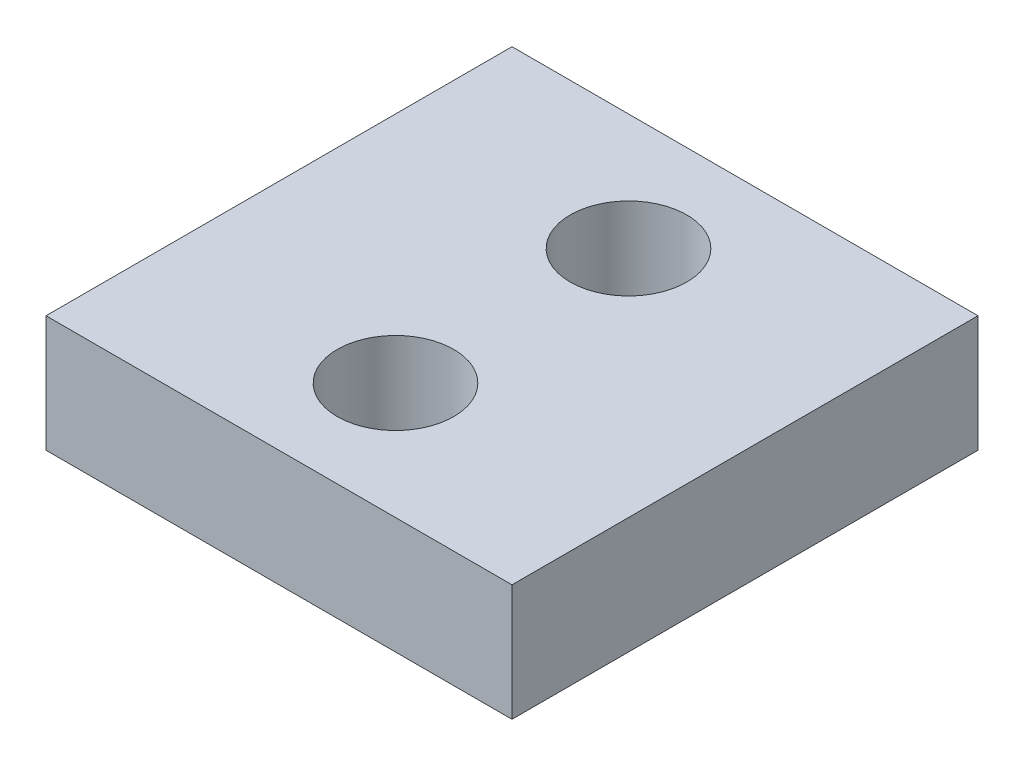
ISO-10303-21;
HEADER;
FILE_DESCRIPTION(('STEP AP214'),'2;1');
FILE_NAME('part.step','',(''),(''),'','','');
FILE_SCHEMA(('AUTOMOTIVE_DESIGN { 1 0 10303 214 1 1 1 1 }'));
ENDSEC;
DATA;
#1=APPLICATION_CONTEXT('core data for automotive mechanical design processes');
#2=APPLICATION_PROTOCOL_DEFINITION('international standard','automotive_design',2000,#1);
#3=PRODUCT_CONTEXT('',#1,'mechanical');
#4=PRODUCT('Part','Part','',(#3));
#5=PRODUCT_RELATED_PRODUCT_CATEGORY('part','',(#4));
#6=PRODUCT_DEFINITION_FORMATION('','',#4);
#7=PRODUCT_DEFINITION_CONTEXT('part definition',#1,'design');
#8=PRODUCT_DEFINITION('design','',#6,#7);
#9=PRODUCT_DEFINITION_SHAPE('','',#8);
#10=(LENGTH_UNIT() NAMED_UNIT(*) SI_UNIT(.MILLI.,.METRE.));
#11=(NAMED_UNIT(*) PLANE_ANGLE_UNIT() SI_UNIT($,.RADIAN.));
#12=(NAMED_UNIT(*) SI_UNIT($,.STERADIAN.) SOLID_ANGLE_UNIT());
#13=UNCERTAINTY_MEASURE_WITH_UNIT(LENGTH_MEASURE(1.E-05),#10,'distance_accuracy_value','');
#14=(GEOMETRIC_REPRESENTATION_CONTEXT(3) GLOBAL_UNCERTAINTY_ASSIGNED_CONTEXT((#13)) GLOBAL_UNIT_ASSIGNED_CONTEXT((#10,
#11,#12)) REPRESENTATION_CONTEXT('',''));
#15=CARTESIAN_POINT('',(0.,0.,0.));
#16=DIRECTION('',(0.,0.,1.));
#17=DIRECTION('',(1.,0.,0.));
#18=AXIS2_PLACEMENT_3D('',#15,#16,#17);
#19=CARTESIAN_POINT('',(-12.7,6.35,12.7));
#20=DIRECTION('',(1.,0.,0.));
#21=DIRECTION('',(0.,0.,-1.));
#22=AXIS2_PLACEMENT_3D('',#19,#20,#21);
#23=PLANE('',#22);
#24=DIRECTION('',(0.,0.,1.));
#25=VECTOR('',#24,1.);
#26=CARTESIAN_POINT('',(-12.7,0.,12.7));
#27=LINE('',#26,#25);
#28=CARTESIAN_POINT('',(-12.7,0.,-12.7));
#29=VERTEX_POINT('',#28);
#30=CARTESIAN_POINT('',(-12.7,0.,12.7));
#31=VERTEX_POINT('',#30);
#32=EDGE_CURVE('E100',#29,#31,#27,.T.);
#33=ORIENTED_EDGE('',*,*,#32,.T.);
#34=DIRECTION('',(0.,-1.,0.));
#35=VECTOR('',#34,1.);
#36=CARTESIAN_POINT('',(-12.7,6.35,12.7));
#37=LINE('',#36,#35);
#38=CARTESIAN_POINT('',(-12.7,6.35,12.7));
#39=VERTEX_POINT('',#38);
#40=EDGE_CURVE('E11',#39,#31,#37,.T.);
#41=ORIENTED_EDGE('',*,*,#40,.F.);
#42=DIRECTION('',(0.,0.,1.));
#43=VECTOR('',#42,1.);
#44=CARTESIAN_POINT('',(-12.7,6.35,12.7));
#45=LINE('',#44,#43);
#46=CARTESIAN_POINT('',(-12.7,6.35,-12.7));
#47=VERTEX_POINT('',#46);
#48=EDGE_CURVE('E88',#47,#39,#45,.T.);
#49=ORIENTED_EDGE('',*,*,#48,.F.);
#50=DIRECTION('',(0.,-1.,0.));
#51=VECTOR('',#50,1.);
#52=CARTESIAN_POINT('',(-12.7,6.35,-12.7));
#53=LINE('',#52,#51);
#54=EDGE_CURVE('E96',#47,#29,#53,.T.);
#55=ORIENTED_EDGE('',*,*,#54,.T.);
#56=EDGE_LOOP('',(#33,#41,#49,#55));
#57=FACE_BOUND('',#56,.T.);
#58=ADVANCED_FACE('F37',(#57),#23,.F.);
#59=CARTESIAN_POINT('',(12.7,6.35,12.7));
#60=DIRECTION('',(0.,0.,-1.));
#61=DIRECTION('',(-1.,0.,0.));
#62=AXIS2_PLACEMENT_3D('',#59,#60,#61);
#63=PLANE('',#62);
#64=DIRECTION('',(1.,0.,0.));
#65=VECTOR('',#64,1.);
#66=CARTESIAN_POINT('',(12.7,0.,12.7));
#67=LINE('',#66,#65);
#68=CARTESIAN_POINT('',(12.7,0.,12.7));
#69=VERTEX_POINT('',#68);
#70=EDGE_CURVE('E92',#31,#69,#67,.T.);
#71=ORIENTED_EDGE('',*,*,#70,.T.);
#72=DIRECTION('',(0.,-1.,0.));
#73=VECTOR('',#72,1.);
#74=CARTESIAN_POINT('',(12.7,6.35,12.7));
#75=LINE('',#74,#73);
#76=CARTESIAN_POINT('',(12.7,6.35,12.7));
#77=VERTEX_POINT('',#76);
#78=EDGE_CURVE('E45',#77,#69,#75,.T.);
#79=ORIENTED_EDGE('',*,*,#78,.F.);
#80=DIRECTION('',(1.,0.,0.));
#81=VECTOR('',#80,1.);
#82=CARTESIAN_POINT('',(12.7,6.35,12.7));
#83=LINE('',#82,#81);
#84=EDGE_CURVE('E83',#39,#77,#83,.T.);
#85=ORIENTED_EDGE('',*,*,#84,.F.);
#86=ORIENTED_EDGE('',*,*,#40,.T.);
#87=EDGE_LOOP('',(#71,#79,#85,#86));
#88=FACE_BOUND('',#87,.T.);
#89=ADVANCED_FACE('F91',(#88),#63,.F.);
#90=CARTESIAN_POINT('',(12.7,6.35,12.7));
#91=DIRECTION('',(-1.,0.,0.));
#92=DIRECTION('',(0.,0.,1.));
#93=AXIS2_PLACEMENT_3D('',#90,#91,#92);
#94=PLANE('',#93);
#95=DIRECTION('',(0.,0.,-1.));
#96=VECTOR('',#95,1.);
#97=CARTESIAN_POINT('',(12.7,0.,12.7));
#98=LINE('',#97,#96);
#99=CARTESIAN_POINT('',(12.7,0.,-12.7));
#100=VERTEX_POINT('',#99);
#101=EDGE_CURVE('E70',#69,#100,#98,.T.);
#102=ORIENTED_EDGE('',*,*,#101,.T.);
#103=DIRECTION('',(0.,-1.,0.));
#104=VECTOR('',#103,1.);
#105=CARTESIAN_POINT('',(12.7,6.35,-12.7));
#106=LINE('',#105,#104);
#107=CARTESIAN_POINT('',(12.7,6.35,-12.7));
#108=VERTEX_POINT('',#107);
#109=EDGE_CURVE('E93',#108,#100,#106,.T.);
#110=ORIENTED_EDGE('',*,*,#109,.F.);
#111=DIRECTION('',(0.,0.,-1.));
#112=VECTOR('',#111,1.);
#113=CARTESIAN_POINT('',(12.7,6.35,12.7));
#114=LINE('',#113,#112);
#115=EDGE_CURVE('E86',#77,#108,#114,.T.);
#116=ORIENTED_EDGE('',*,*,#115,.F.);
#117=ORIENTED_EDGE('',*,*,#78,.T.);
#118=EDGE_LOOP('',(#102,#110,#116,#117));
#119=FACE_BOUND('',#118,.T.);
#120=ADVANCED_FACE('F94',(#119),#94,.F.);
#121=CARTESIAN_POINT('',(12.7,6.35,-12.7));
#122=DIRECTION('',(0.,0.,1.));
#123=DIRECTION('',(1.,0.,0.));
#124=AXIS2_PLACEMENT_3D('',#121,#122,#123);
#125=PLANE('',#124);
#126=DIRECTION('',(-1.,0.,0.));
#127=VECTOR('',#126,1.);
#128=CARTESIAN_POINT('',(12.7,0.,-12.7));
#129=LINE('',#128,#127);
#130=EDGE_CURVE('E76',#100,#29,#129,.T.);
#131=ORIENTED_EDGE('',*,*,#130,.T.);
#132=ORIENTED_EDGE('',*,*,#54,.F.);
#133=DIRECTION('',(-1.,0.,0.));
#134=VECTOR('',#133,1.);
#135=CARTESIAN_POINT('',(12.7,6.35,-12.7));
#136=LINE('',#135,#134);
#137=EDGE_CURVE('E53',#108,#47,#136,.T.);
#138=ORIENTED_EDGE('',*,*,#137,.F.);
#139=ORIENTED_EDGE('',*,*,#109,.T.);
#140=EDGE_LOOP('',(#131,#132,#138,#139));
#141=FACE_BOUND('',#140,.T.);
#142=ADVANCED_FACE('F108',(#141),#125,.F.);
#143=CARTESIAN_POINT('',(-12.7,6.35,-12.7));
#144=DIRECTION('',(0.,1.,0.));
#145=DIRECTION('',(0.,0.,1.));
#146=AXIS2_PLACEMENT_3D('',#143,#144,#145);
#147=PLANE('',#146);
#148=CARTESIAN_POINT('',(0.,6.35,6.34999999999999));
#149=DIRECTION('',(0.,1.,0.));
#150=DIRECTION('',(0.,0.,1.));
#151=AXIS2_PLACEMENT_3D('',#148,#149,#150);
#152=CIRCLE('',#151,3.17499999999999);
#153=CARTESIAN_POINT('',(0.,6.35,9.52499999999998));
#154=VERTEX_POINT('',#153);
#155=EDGE_CURVE('E122',#154,#154,#152,.T.);
#156=ORIENTED_EDGE('',*,*,#155,.F.);
#157=EDGE_LOOP('',(#156));
#158=FACE_BOUND('',#157,.T.);
#159=CARTESIAN_POINT('',(0.,6.35,-6.35000000000001));
#160=DIRECTION('',(0.,1.,0.));
#161=DIRECTION('',(0.,0.,1.));
#162=AXIS2_PLACEMENT_3D('',#159,#160,#161);
#163=CIRCLE('',#162,3.17499999999999);
#164=CARTESIAN_POINT('',(0.,6.35,-3.17500000000002));
#165=VERTEX_POINT('',#164);
#166=EDGE_CURVE('E116',#165,#165,#163,.T.);
#167=ORIENTED_EDGE('',*,*,#166,.F.);
#168=EDGE_LOOP('',(#167));
#169=FACE_BOUND('',#168,.T.);
#170=ORIENTED_EDGE('',*,*,#48,.T.);
#171=ORIENTED_EDGE('',*,*,#84,.T.);
#172=ORIENTED_EDGE('',*,*,#115,.T.);
#173=ORIENTED_EDGE('',*,*,#137,.T.);
#174=EDGE_LOOP('',(#170,#171,#172,#173));
#175=FACE_BOUND('',#174,.T.);
#176=ADVANCED_FACE('F84',(#158,#169,#175),#147,.T.);
#177=CARTESIAN_POINT('',(-12.7,0.,-12.7));
#178=DIRECTION('',(0.,1.,0.));
#179=DIRECTION('',(0.,0.,1.));
#180=AXIS2_PLACEMENT_3D('',#177,#178,#179);
#181=PLANE('',#180);
#182=CARTESIAN_POINT('',(0.,0.,6.34999999999999));
#183=DIRECTION('',(0.,1.,0.));
#184=DIRECTION('',(0.,0.,1.));
#185=AXIS2_PLACEMENT_3D('',#182,#183,#184);
#186=CIRCLE('',#185,3.175);
#187=CARTESIAN_POINT('',(0.,0.,9.52499999999999));
#188=VERTEX_POINT('',#187);
#189=EDGE_CURVE('E119',#188,#188,#186,.T.);
#190=ORIENTED_EDGE('',*,*,#189,.T.);
#191=EDGE_LOOP('',(#190));
#192=FACE_BOUND('',#191,.T.);
#193=CARTESIAN_POINT('',(0.,0.,-6.35000000000001));
#194=DIRECTION('',(0.,1.,0.));
#195=DIRECTION('',(0.,0.,1.));
#196=AXIS2_PLACEMENT_3D('',#193,#194,#195);
#197=CIRCLE('',#196,3.175);
#198=CARTESIAN_POINT('',(0.,0.,-3.17500000000001));
#199=VERTEX_POINT('',#198);
#200=EDGE_CURVE('E103',#199,#199,#197,.T.);
#201=ORIENTED_EDGE('',*,*,#200,.T.);
#202=EDGE_LOOP('',(#201));
#203=FACE_BOUND('',#202,.T.);
#204=ORIENTED_EDGE('',*,*,#32,.F.);
#205=ORIENTED_EDGE('',*,*,#130,.F.);
#206=ORIENTED_EDGE('',*,*,#101,.F.);
#207=ORIENTED_EDGE('',*,*,#70,.F.);
#208=EDGE_LOOP('',(#204,#205,#206,#207));
#209=FACE_BOUND('',#208,.T.);
#210=ADVANCED_FACE('F111',(#192,#203,#209),#181,.F.);
#211=CARTESIAN_POINT('',(0.,6.35,-6.35000000000001));
#212=DIRECTION('',(0.,1.,0.));
#213=DIRECTION('',(0.,0.,1.));
#214=AXIS2_PLACEMENT_3D('',#211,#212,#213);
#215=CYLINDRICAL_SURFACE('',#214,3.17499999999999);
#216=ORIENTED_EDGE('',*,*,#200,.F.);
#217=EDGE_LOOP('',(#216));
#218=FACE_BOUND('',#217,.T.);
#219=ORIENTED_EDGE('',*,*,#166,.T.);
#220=EDGE_LOOP('',(#219));
#221=FACE_BOUND('',#220,.T.);
#222=ADVANCED_FACE('F133',(#218,#221),#215,.F.);
#223=CARTESIAN_POINT('',(0.,6.35,6.34999999999999));
#224=DIRECTION('',(0.,1.,0.));
#225=DIRECTION('',(0.,0.,1.));
#226=AXIS2_PLACEMENT_3D('',#223,#224,#225);
#227=CYLINDRICAL_SURFACE('',#226,3.17499999999999);
#228=ORIENTED_EDGE('',*,*,#189,.F.);
#229=EDGE_LOOP('',(#228));
#230=FACE_BOUND('',#229,.T.);
#231=ORIENTED_EDGE('',*,*,#155,.T.);
#232=EDGE_LOOP('',(#231));
#233=FACE_BOUND('',#232,.T.);
#234=ADVANCED_FACE('F126',(#230,#233),#227,.F.);
#235=CLOSED_SHELL('',(#58,#89,#120,#142,#176,#210,#222,#234));
#236=MANIFOLD_SOLID_BREP('B2',#235);
#237=ADVANCED_BREP_SHAPE_REPRESENTATION('',(#18,#236),#14);
#238=SHAPE_DEFINITION_REPRESENTATION(#9,#237);
ENDSEC;
END-ISO-10303-21;
